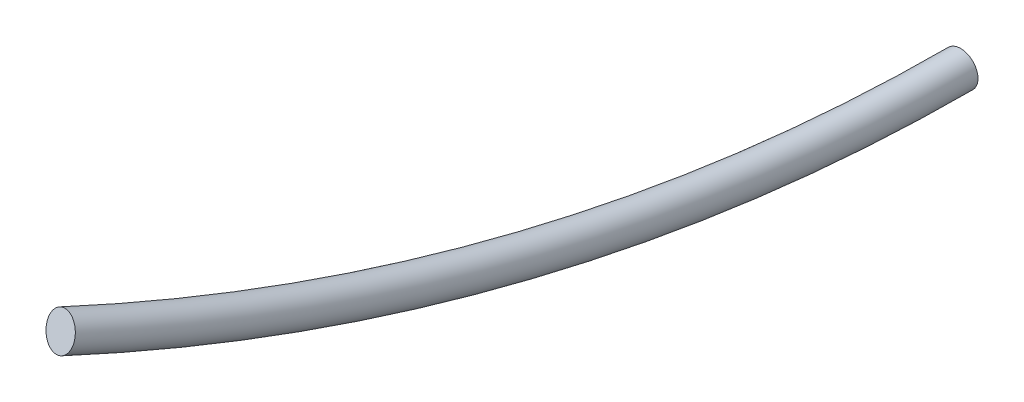
ISO-10303-21;
HEADER;
FILE_DESCRIPTION(('STEP AP214'),'2;1');
FILE_NAME('part.step','',(''),(''),'','','');
FILE_SCHEMA(('AUTOMOTIVE_DESIGN { 1 0 10303 214 1 1 1 1 }'));
ENDSEC;
DATA;
#1=APPLICATION_CONTEXT('core data for automotive mechanical design processes');
#2=APPLICATION_PROTOCOL_DEFINITION('international standard','automotive_design',2000,#1);
#3=PRODUCT_CONTEXT('',#1,'mechanical');
#4=PRODUCT('Part','Part','',(#3));
#5=PRODUCT_RELATED_PRODUCT_CATEGORY('part','',(#4));
#6=PRODUCT_DEFINITION_FORMATION('','',#4);
#7=PRODUCT_DEFINITION_CONTEXT('part definition',#1,'design');
#8=PRODUCT_DEFINITION('design','',#6,#7);
#9=PRODUCT_DEFINITION_SHAPE('','',#8);
#10=(LENGTH_UNIT() NAMED_UNIT(*) SI_UNIT(.MILLI.,.METRE.));
#11=(NAMED_UNIT(*) PLANE_ANGLE_UNIT() SI_UNIT($,.RADIAN.));
#12=(NAMED_UNIT(*) SI_UNIT($,.STERADIAN.) SOLID_ANGLE_UNIT());
#13=UNCERTAINTY_MEASURE_WITH_UNIT(LENGTH_MEASURE(1.E-05),#10,'distance_accuracy_value','');
#14=(GEOMETRIC_REPRESENTATION_CONTEXT(3) GLOBAL_UNCERTAINTY_ASSIGNED_CONTEXT((#13)) GLOBAL_UNIT_ASSIGNED_CONTEXT((#10,
#11,#12)) REPRESENTATION_CONTEXT('',''));
#15=CARTESIAN_POINT('',(0.,0.,0.));
#16=DIRECTION('',(0.,0.,1.));
#17=DIRECTION('',(1.,0.,0.));
#18=AXIS2_PLACEMENT_3D('',#15,#16,#17);
#19=CARTESIAN_POINT('',(-657.063959206117,-6990.2160453204,-2.79776202205539E-11));
#20=DIRECTION('',(0.835444689728451,0.549574535804319,0.));
#21=DIRECTION('',(-0.549574535804319,0.835444689728451,0.));
#22=AXIS2_PLACEMENT_3D('',#19,#20,#21);
#23=TOROIDAL_SURFACE('',#22,6244.73919043432,50.8000000000056);
#24=CARTESIAN_POINT('',(2516.56026589071,-11814.6526473007,2376.90729897005));
#25=DIRECTION('',(-0.209182110836964,0.317991595860901,0.924729251980075));
#26=DIRECTION('',(0.977265812607569,0.0345597455757305,0.209182110836964));
#27=AXIS2_PLACEMENT_3D('',#24,#25,#26);
#28=CIRCLE('',#27,50.8000000000056);
#29=CARTESIAN_POINT('',(2542.37721448032,-11853.8987025653,2396.24307699144));
#30=VERTEX_POINT('',#29);
#31=EDGE_CURVE('E10',#30,#30,#28,.T.);
#32=CARTESIAN_POINT('',(2774.88568259587,-12207.3502407079,0.));
#33=DIRECTION('',(0.,0.,1.));
#34=DIRECTION('',(1.,0.,0.));
#35=AXIS2_PLACEMENT_3D('',#32,#33,#34);
#36=CIRCLE('',#35,50.8000000000056);
#37=CARTESIAN_POINT('',(2802.80406901473,-12249.7908309461,2.27593669465236E-13));
#38=VERTEX_POINT('',#37);
#39=EDGE_CURVE('E41',#38,#38,#36,.T.);
#40=CARTESIAN_POINT('',(-657.063959206117,-6990.2160453204,-2.79776202205539E-11));
#41=DIRECTION('',(0.835444689728451,0.549574535804319,0.));
#42=DIRECTION('',(-0.549574535804319,0.835444689728451,0.));
#43=AXIS2_PLACEMENT_3D('',#40,#41,#42);
#44=CIRCLE('',#43,6295.53919043433);
#45=EDGE_CURVE('',#30,#38,#44,.T.);
#46=ORIENTED_EDGE('',*,*,#31,.F.);
#47=ORIENTED_EDGE('',*,*,#39,.T.);
#48=ORIENTED_EDGE('',*,*,#45,.T.);
#49=ORIENTED_EDGE('',*,*,#45,.F.);
#50=EDGE_LOOP('',(#46,#48,#47,#49));
#51=FACE_BOUND('',#50,.T.);
#52=ADVANCED_FACE('F35',(#51),#23,.T.);
#53=CARTESIAN_POINT('',(2516.56026589071,-11814.6526473007,2376.90729897005));
#54=DIRECTION('',(-0.209182110836964,0.317991595860901,0.924729251980075));
#55=DIRECTION('',(0.977265812607569,0.0345597455757305,0.209182110836964));
#56=AXIS2_PLACEMENT_3D('',#53,#54,#55);
#57=PLANE('',#56);
#58=ORIENTED_EDGE('',*,*,#31,.T.);
#59=EDGE_LOOP('',(#58));
#60=FACE_BOUND('',#59,.T.);
#61=ADVANCED_FACE('F50',(#60),#57,.T.);
#62=CARTESIAN_POINT('',(2774.88568259587,-12207.3502407079,0.));
#63=DIRECTION('',(0.,0.,1.));
#64=DIRECTION('',(1.,0.,0.));
#65=AXIS2_PLACEMENT_3D('',#62,#63,#64);
#66=PLANE('',#65);
#67=ORIENTED_EDGE('',*,*,#39,.F.);
#68=EDGE_LOOP('',(#67));
#69=FACE_BOUND('',#68,.T.);
#70=ADVANCED_FACE('F48',(#69),#66,.F.);
#71=CLOSED_SHELL('',(#52,#61,#70));
#72=MANIFOLD_SOLID_BREP('B2',#71);
#73=ADVANCED_BREP_SHAPE_REPRESENTATION('',(#18,#72),#14);
#74=SHAPE_DEFINITION_REPRESENTATION(#9,#73);
ENDSEC;
END-ISO-10303-21;
